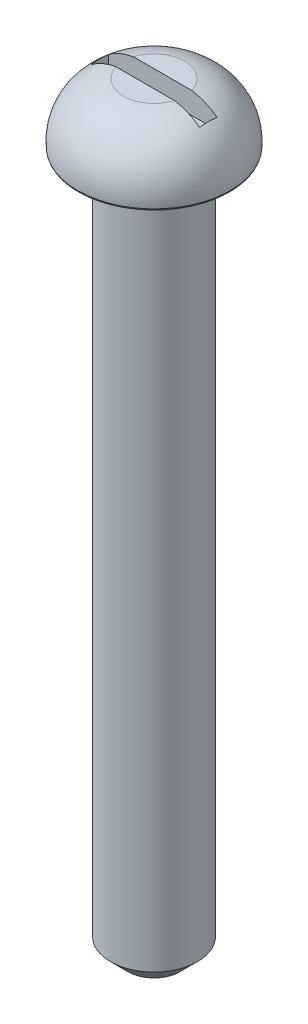
ISO-10303-21;
HEADER;
FILE_DESCRIPTION(('STEP AP214'),'2;1');
FILE_NAME('part.step','',(''),(''),'','','');
FILE_SCHEMA(('AUTOMOTIVE_DESIGN { 1 0 10303 214 1 1 1 1 }'));
ENDSEC;
DATA;
#1=APPLICATION_CONTEXT('core data for automotive mechanical design processes');
#2=APPLICATION_PROTOCOL_DEFINITION('international standard','automotive_design',2000,#1);
#3=PRODUCT_CONTEXT('',#1,'mechanical');
#4=PRODUCT('Part','Part','',(#3));
#5=PRODUCT_RELATED_PRODUCT_CATEGORY('part','',(#4));
#6=PRODUCT_DEFINITION_FORMATION('','',#4);
#7=PRODUCT_DEFINITION_CONTEXT('part definition',#1,'design');
#8=PRODUCT_DEFINITION('design','',#6,#7);
#9=PRODUCT_DEFINITION_SHAPE('','',#8);
#10=(LENGTH_UNIT() NAMED_UNIT(*) SI_UNIT(.MILLI.,.METRE.));
#11=(NAMED_UNIT(*) PLANE_ANGLE_UNIT() SI_UNIT($,.RADIAN.));
#12=(NAMED_UNIT(*) SI_UNIT($,.STERADIAN.) SOLID_ANGLE_UNIT());
#13=UNCERTAINTY_MEASURE_WITH_UNIT(LENGTH_MEASURE(1.E-05),#10,'distance_accuracy_value','');
#14=(GEOMETRIC_REPRESENTATION_CONTEXT(3) GLOBAL_UNCERTAINTY_ASSIGNED_CONTEXT((#13)) GLOBAL_UNIT_ASSIGNED_CONTEXT((#10,
#11,#12)) REPRESENTATION_CONTEXT('',''));
#15=CARTESIAN_POINT('',(0.,0.,0.));
#16=DIRECTION('',(0.,0.,1.));
#17=DIRECTION('',(1.,0.,0.));
#18=AXIS2_PLACEMENT_3D('',#15,#16,#17);
#19=CARTESIAN_POINT('',(0.,35.,0.));
#20=DIRECTION('',(0.,1.,0.));
#21=DIRECTION('',(0.,0.,1.));
#22=AXIS2_PLACEMENT_3D('',#19,#20,#21);
#23=PLANE('',#22);
#24=DIRECTION('',(-1.,0.,0.));
#25=VECTOR('',#24,1.);
#26=CARTESIAN_POINT('',(-2.5,35.,-0.4));
#27=LINE('',#26,#25);
#28=CARTESIAN_POINT('',(1.34164078649989,35.,-0.4));
#29=VERTEX_POINT('',#28);
#30=CARTESIAN_POINT('',(-1.34164078649989,35.,-0.4));
#31=VERTEX_POINT('',#30);
#32=EDGE_CURVE('E105',#29,#31,#27,.T.);
#33=ORIENTED_EDGE('',*,*,#32,.F.);
#34=CARTESIAN_POINT('',(0.,35.,0.));
#35=DIRECTION('',(0.,-1.,0.));
#36=DIRECTION('',(0.,0.,-1.));
#37=AXIS2_PLACEMENT_3D('',#34,#35,#36);
#38=CIRCLE('',#37,1.4);
#39=EDGE_CURVE('E128',#31,#29,#38,.T.);
#40=ORIENTED_EDGE('',*,*,#39,.F.);
#41=EDGE_LOOP('',(#33,#40));
#42=FACE_BOUND('',#41,.T.);
#43=ADVANCED_FACE('F29',(#42),#23,.T.);
#44=CARTESIAN_POINT('',(1.2,0.,0.));
#45=DIRECTION('',(0.,-1.,0.));
#46=DIRECTION('',(0.,0.,-1.));
#47=AXIS2_PLACEMENT_3D('',#44,#45,#46);
#48=PLANE('',#47);
#49=CARTESIAN_POINT('',(0.,0.,0.));
#50=DIRECTION('',(0.,-1.,0.));
#51=DIRECTION('',(0.,0.,-1.));
#52=AXIS2_PLACEMENT_3D('',#49,#50,#51);
#53=CIRCLE('',#52,1.2);
#54=CARTESIAN_POINT('',(0.,0.,-1.2));
#55=VERTEX_POINT('',#54);
#56=EDGE_CURVE('E115',#55,#55,#53,.T.);
#57=ORIENTED_EDGE('',*,*,#56,.T.);
#58=EDGE_LOOP('',(#57));
#59=FACE_BOUND('',#58,.T.);
#60=ADVANCED_FACE('F31',(#59),#48,.T.);
#61=DIRECTION('',(1.,0.,0.));
#62=VECTOR('',#61,1.);
#63=CARTESIAN_POINT('',(-2.5,35.,0.4));
#64=LINE('',#63,#62);
#65=CARTESIAN_POINT('',(-1.34164078649989,35.,0.4));
#66=VERTEX_POINT('',#65);
#67=CARTESIAN_POINT('',(1.34164078649989,35.,0.4));
#68=VERTEX_POINT('',#67);
#69=EDGE_CURVE('E107',#66,#68,#64,.T.);
#70=ORIENTED_EDGE('',*,*,#69,.F.);
#71=EDGE_CURVE('E131',#68,#66,#38,.T.);
#72=ORIENTED_EDGE('',*,*,#71,.F.);
#73=EDGE_LOOP('',(#70,#72));
#74=FACE_BOUND('',#73,.T.);
#75=ADVANCED_FACE('F176',(#74),#23,.T.);
#76=CARTESIAN_POINT('',(0.,32.5125,0.));
#77=DIRECTION('',(0.,-1.,0.));
#78=DIRECTION('',(0.,0.,-1.));
#79=AXIS2_PLACEMENT_3D('',#76,#77,#78);
#80=DEGENERATE_TOROIDAL_SURFACE('',#79,1.,2.5194555463433,.T.);
#81=CARTESIAN_POINT('',(0.,34.9594687881132,-0.4));
#82=CARTESIAN_POINT('',(-0.0338382677614268,34.9594721754177,-0.4));
#83=CARTESIAN_POINT('',(-0.067677964119435,34.9605534690235,-0.4));
#84=CARTESIAN_POINT('',(-0.135250580531707,34.9645271586809,-0.4));
#85=CARTESIAN_POINT('',(-0.168983458976539,34.9674201897673,-0.4));
#86=CARTESIAN_POINT('',(-0.236586103651417,34.9742723387306,-0.4));
#87=CARTESIAN_POINT('',(-0.270455020948054,34.9782392285523,-0.4));
#88=CARTESIAN_POINT('',(-0.338156940635543,34.9864955449094,-0.4));
#89=CARTESIAN_POINT('',(-0.371989936105779,34.9907850250498,-0.4));
#90=CARTESIAN_POINT('',(-0.455604149313946,35.0010989072908,-0.4));
#91=CARTESIAN_POINT('',(-0.505403039900188,35.0069905560453,-0.4));
#92=CARTESIAN_POINT('',(-0.605160163724098,35.0172184164192,-0.4));
#93=CARTESIAN_POINT('',(-0.655118370099626,35.021554877577,-0.4));
#94=CARTESIAN_POINT('',(-0.755158183029392,35.0281116283189,-0.4));
#95=CARTESIAN_POINT('',(-0.805239724114253,35.0303328670776,-0.4));
#96=CARTESIAN_POINT('',(-0.905451481224646,35.0323446383411,-0.4));
#97=CARTESIAN_POINT('',(-0.955581698913417,35.0321350846395,-0.4));
#98=CARTESIAN_POINT('',(-1.10519744004029,35.0275826093243,-0.4));
#99=CARTESIAN_POINT('',(-1.20460157264623,35.0193672135559,-0.4));
#100=CARTESIAN_POINT('',(-1.40192321413768,34.9918916724499,-0.4));
#101=CARTESIAN_POINT('',(-1.49984015178237,34.9726273880546,-0.4));
#102=CARTESIAN_POINT('',(-1.66562418126213,34.9299930807012,-0.4));
#103=CARTESIAN_POINT('',(-1.73418957692369,34.9093063038867,-0.4));
#104=CARTESIAN_POINT('',(-1.8693166192456,34.8623062089933,-0.4));
#105=CARTESIAN_POINT('',(-1.9358791538299,34.8359954273999,-0.4));
#106=CARTESIAN_POINT('',(-2.13232230422447,34.7485950153914,-0.4));
#107=CARTESIAN_POINT('',(-2.25860062073282,34.6791290253755,-0.4));
#108=CARTESIAN_POINT('',(-2.49744991030645,34.5198455931525,-0.4));
#109=CARTESIAN_POINT('',(-2.61002524010937,34.4300346455554,-0.4));
#110=CARTESIAN_POINT('',(-2.81813579673432,34.2326675848493,-0.4));
#111=CARTESIAN_POINT('',(-2.9136919776501,34.125133611118,-0.4));
#112=CARTESIAN_POINT('',(-3.084020861249,33.8967637441041,-0.4));
#113=CARTESIAN_POINT('',(-3.15903353936496,33.7761066918437,-0.4));
#114=CARTESIAN_POINT('',(-3.28766382741802,33.5238219313858,-0.4));
#115=CARTESIAN_POINT('',(-3.34127386321256,33.3921903593208,-0.4));
#116=CARTESIAN_POINT('',(-3.42530915106019,33.1223801199839,-0.4));
#117=CARTESIAN_POINT('',(-3.45583823753319,32.984233780706,-0.4));
#118=CARTESIAN_POINT('',(-3.49323058953172,32.7047946739299,-0.4));
#119=CARTESIAN_POINT('',(-3.50009745955316,32.5635023889581,-0.4));
#120=CARTESIAN_POINT('',(-3.48998437740454,32.2819727914454,-0.4));
#121=CARTESIAN_POINT('',(-3.47303776304047,32.1417342798249,-0.4));
#122=CARTESIAN_POINT('',(-3.41583978349253,31.8660706381648,-0.4));
#123=CARTESIAN_POINT('',(-3.37558477651418,31.7306462638152,-0.4));
#124=CARTESIAN_POINT('',(-3.27291000213663,31.4684418568154,-0.4));
#125=CARTESIAN_POINT('',(-3.21048499893456,31.3416638745886,-0.4));
#126=CARTESIAN_POINT('',(-3.06529958238939,31.1004253875458,-0.4));
#127=CARTESIAN_POINT('',(-2.98254846845237,30.9859592842568,-0.4));
#128=CARTESIAN_POINT('',(-2.79895170451083,30.772356227364,-0.4));
#129=CARTESIAN_POINT('',(-2.69808464515237,30.6732376723482,-0.4));
#130=CARTESIAN_POINT('',(-2.48109536029555,30.4931192895068,-0.4));
#131=CARTESIAN_POINT('',(-2.36495283010315,30.4121439725998,-0.4));
#132=CARTESIAN_POINT('',(-2.12003686955878,30.2702055463965,-0.4));
#133=CARTESIAN_POINT('',(-1.99119324147536,30.2093628035941,-0.4));
#134=CARTESIAN_POINT('',(-1.792084554005,30.1348165249818,-0.4));
#135=CARTESIAN_POINT('',(-1.72482351761207,30.112770190514,-0.4));
#136=CARTESIAN_POINT('',(-1.58871399977605,30.074248069245,-0.4));
#137=CARTESIAN_POINT('',(-1.51986566275126,30.0577717777811,-0.4));
#138=CARTESIAN_POINT('',(-1.37991833917445,30.0301913167248,-0.4));
#139=CARTESIAN_POINT('',(-1.30880096493827,30.0191810623686,-0.4));
#140=CARTESIAN_POINT('',(-1.16590883388618,30.0028540264087,-0.4));
#141=CARTESIAN_POINT('',(-1.09413397404903,29.9975381529959,-0.4));
#142=CARTESIAN_POINT('',(-0.950184709290663,29.9923360188387,-0.4));
#143=CARTESIAN_POINT('',(-0.878009750752931,29.9924659131582,-0.4));
#144=CARTESIAN_POINT('',(-0.733868359233075,29.9976141000356,-0.4));
#145=CARTESIAN_POINT('',(-0.661901885229659,30.0026313546615,-0.4));
#146=CARTESIAN_POINT('',(-0.527362844770211,30.0154201147344,-0.4));
#147=CARTESIAN_POINT('',(-0.464745964796624,30.0227664151524,-0.4));
#148=CARTESIAN_POINT('',(-0.370921074758577,30.0343512736872,-0.4));
#149=CARTESIAN_POINT('',(-0.339674021780249,30.0383056106516,-0.4));
#150=CARTESIAN_POINT('',(-0.27714074503957,30.0459577789511,-0.4));
#151=CARTESIAN_POINT('',(-0.24585451499118,30.0496555616753,-0.4));
#152=CARTESIAN_POINT('',(-0.183022337538641,30.0562464425247,-0.4));
#153=CARTESIAN_POINT('',(-0.151475896905257,30.0591351211382,-0.4));
#154=CARTESIAN_POINT('',(-0.0882845194117533,30.0634407062094,-0.4));
#155=CARTESIAN_POINT('',(-0.0566396201019121,30.0648581178138,-0.4));
#156=CARTESIAN_POINT('',(0.00670900055784086,30.0658228744264,-0.4));
#157=CARTESIAN_POINT('',(0.0384127491098397,30.0653686014411,-0.4));
#158=CARTESIAN_POINT('',(0.101755848962485,30.0627217036994,-0.4));
#159=CARTESIAN_POINT('',(0.133395161231615,30.0605282297223,-0.4));
#160=CARTESIAN_POINT('',(0.197075668927702,30.0549206280494,-0.4));
#161=CARTESIAN_POINT('',(0.229115032813026,30.0514872303989,-0.4));
#162=CARTESIAN_POINT('',(0.293132454280722,30.0440721569489,-0.4));
#163=CARTESIAN_POINT('',(0.325110499752561,30.0400903822904,-0.4));
#164=CARTESIAN_POINT('',(0.389068757237893,30.032113224633,-0.4));
#165=CARTESIAN_POINT('',(0.421048969105001,30.0281178401912,-0.4));
#166=CARTESIAN_POINT('',(0.485051815385014,30.0204868263652,-0.4));
#167=CARTESIAN_POINT('',(0.517074449026828,30.0168511905303,-0.4));
#168=CARTESIAN_POINT('',(0.613199905067885,30.0068908859735,-0.4));
#169=CARTESIAN_POINT('',(0.67740855069488,30.0015058987141,-0.4));
#170=CARTESIAN_POINT('',(0.806040956986536,29.9944125710688,-0.4));
#171=CARTESIAN_POINT('',(0.870464712950289,29.9927041508571,-0.4));
#172=CARTESIAN_POINT('',(0.998362213092594,29.9934918122463,-0.4));
#173=CARTESIAN_POINT('',(1.06183615678955,29.9959271498237,-0.4));
#174=CARTESIAN_POINT('',(1.18845961005121,30.0051429318533,-0.4));
#175=CARTESIAN_POINT('',(1.25160909489982,30.0119237025194,-0.4));
#176=CARTESIAN_POINT('',(1.44046174579123,30.0390588425836,-0.4));
#177=CARTESIAN_POINT('',(1.56529661737749,30.0662059685067,-0.4));
#178=CARTESIAN_POINT('',(1.75532938071436,30.1225098666057,-0.4));
#179=CARTESIAN_POINT('',(1.82244963264302,30.1454497391749,-0.400000000000001));
#180=CARTESIAN_POINT('',(1.95446682454811,30.1967759205072,-0.400000000000001));
#181=CARTESIAN_POINT('',(2.01936724896691,30.2251531837482,-0.400000000000001));
#182=CARTESIAN_POINT('',(2.14746610091274,30.287655872903,-0.400000000000001));
#183=CARTESIAN_POINT('',(2.21062807916091,30.3218560714777,-0.400000000000001));
#184=CARTESIAN_POINT('',(2.33384141088278,30.3954981556499,-0.400000000000001));
#185=CARTESIAN_POINT('',(2.39389112687907,30.4349427623866,-0.400000000000001));
#186=CARTESIAN_POINT('',(2.56822105293429,30.5604414895362,-0.400000000000001));
#187=CARTESIAN_POINT('',(2.67727417342556,30.6539498739746,-0.400000000000001));
#188=CARTESIAN_POINT('',(2.87731664505904,30.8575381230657,-0.400000000000001));
#189=CARTESIAN_POINT('',(2.96839942775862,30.967526745611,-0.400000000000001));
#190=CARTESIAN_POINT('',(3.13011034367072,31.2005805767337,-0.400000000000001));
#191=CARTESIAN_POINT('',(3.2008690104347,31.3235550656091,-0.400000000000001));
#192=CARTESIAN_POINT('',(3.32076250094826,31.5798864015786,-0.400000000000001));
#193=CARTESIAN_POINT('',(3.36985981264247,31.7132607924853,-0.400000000000001));
#194=CARTESIAN_POINT('',(3.44466082174416,31.9857648809142,-0.400000000000001));
#195=CARTESIAN_POINT('',(3.47046942013737,32.124865789526,-0.400000000000001));
#196=CARTESIAN_POINT('',(3.49832209574621,32.4053506959011,-0.400000000000001));
#197=CARTESIAN_POINT('',(3.50037915256109,32.5467334044125,-0.400000000000001));
#198=CARTESIAN_POINT('',(3.48071400899756,32.827680796085,-0.400000000000001));
#199=CARTESIAN_POINT('',(3.45901751439648,32.9672472794955,-0.400000000000001));
#200=CARTESIAN_POINT('',(3.39249967383479,33.2407968712602,-0.400000000000001));
#201=CARTESIAN_POINT('',(3.34767190795041,33.3747784183909,-0.400000000000001));
#202=CARTESIAN_POINT('',(3.23615362082009,33.6333685749116,-0.400000000000001));
#203=CARTESIAN_POINT('',(3.16945508114511,33.7579737260251,-0.400000000000001));
#204=CARTESIAN_POINT('',(3.01616115015903,33.994170437646,-0.400000000000001));
#205=CARTESIAN_POINT('',(2.92957716226702,34.1057694015433,-0.400000000000001));
#206=CARTESIAN_POINT('',(2.7388440090825,34.3130500055762,-0.400000000000001));
#207=CARTESIAN_POINT('',(2.63467263893206,34.4087112164015,-0.400000000000001));
#208=CARTESIAN_POINT('',(2.41166340004832,34.5814542600167,-0.400000000000001));
#209=CARTESIAN_POINT('',(2.29280072738463,34.6585040042624,-0.400000000000001));
#210=CARTESIAN_POINT('',(2.0430030813058,34.7922605207593,-0.400000000000001));
#211=CARTESIAN_POINT('',(1.9119902448074,34.8488227998933,-0.4));
#212=CARTESIAN_POINT('',(1.7102956255584,34.9167355419974,-0.4));
#213=CARTESIAN_POINT('',(1.6423386050226,34.9365291975629,-0.4));
#214=CARTESIAN_POINT('',(1.50500335369697,34.970535819594,-0.4));
#215=CARTESIAN_POINT('',(1.4356246269105,34.9847468022932,-0.4));
#216=CARTESIAN_POINT('',(1.27838918164238,35.0104556218676,-0.4));
#217=CARTESIAN_POINT('',(1.19027247123465,35.0203729092839,-0.4));
#218=CARTESIAN_POINT('',(1.01355864413964,35.031745217942,-0.4));
#219=CARTESIAN_POINT('',(0.924961815219303,35.0332048448398,-0.4));
#220=CARTESIAN_POINT('',(0.791965647083475,35.0297457589619,-0.4));
#221=CARTESIAN_POINT('',(0.747467524576735,35.0276346462116,-0.4));
#222=CARTESIAN_POINT('',(0.658580235401699,35.021753448913,-0.4));
#223=CARTESIAN_POINT('',(0.614191070131035,35.0179833431949,-0.4));
#224=CARTESIAN_POINT('',(0.525521437051802,35.0091681976184,-0.4));
#225=CARTESIAN_POINT('',(0.481241040864881,35.004122470548,-0.4));
#226=CARTESIAN_POINT('',(0.392755822811401,34.9934177415786,-0.4));
#227=CARTESIAN_POINT('',(0.348551004111971,34.9877587145892,-0.4));
#228=CARTESIAN_POINT('',(0.278970443467459,34.9792802111881,-0.4));
#229=CARTESIAN_POINT('',(0.253617379606726,34.976280354131,-0.4));
#230=CARTESIAN_POINT('',(0.202862030439113,34.9707658833481,-0.4));
#231=CARTESIAN_POINT('',(0.177459757037149,34.9682511642246,-0.4));
#232=CARTESIAN_POINT('',(0.126738568217441,34.9640518042722,-0.4));
#233=CARTESIAN_POINT('',(0.101420084319055,34.9623622119908,-0.4));
#234=CARTESIAN_POINT('',(0.0507346632318562,34.9600695076987,-0.4));
#235=CARTESIAN_POINT('',(0.0253677330615109,34.9594662487327,-0.4));
#236=CARTESIAN_POINT('',(0.,34.9594687881132,-0.4));
#237=B_SPLINE_CURVE_WITH_KNOTS('',3,(#81,#82,#83,#84,#85,#86,#87,#88,#89,#90,#91,#92,#93,#94,
#95,#96,#97,#98,#99,#100,#101,#102,#103,#104,#105,#106,#107,#108,#109,#110,#111,#112,#113,#114,
#115,#116,#117,#118,#119,#120,#121,#122,#123,#124,#125,#126,#127,#128,#129,#130,#131,#132,#133,
#134,#135,#136,#137,#138,#139,#140,#141,#142,#143,#144,#145,#146,#147,#148,#149,#150,#151,#152,
#153,#154,#155,#156,#157,#158,#159,#160,#161,#162,#163,#164,#165,#166,#167,#168,#169,#170,#171,
#172,#173,#174,#175,#176,#177,#178,#179,#180,#181,#182,#183,#184,#185,#186,#187,#188,#189,#190,
#191,#192,#193,#194,#195,#196,#197,#198,#199,#200,#201,#202,#203,#204,#205,#206,#207,#208,#209,
#210,#211,#212,#213,#214,#215,#216,#217,#218,#219,#220,#221,#222,#223,#224,#225,#226,#227,#228,
#229,#230,#231,#232,#233,#234,#235,#236),.UNSPECIFIED.,.T.,.F.,(4,2,2,2,2,2,2,2,2,2,2,2,2,2,2,2,
2,2,2,2,2,2,2,2,2,2,2,2,2,2,2,2,2,2,2,2,2,2,2,2,2,2,2,2,2,2,2,2,2,2,2,2,2,2,2,2,2,2,2,2,2,2,2,2,
2,2,2,2,2,2,2,2,2,2,2,2,2,4),(0.,0.101504820932103,0.203045240398577,0.305341160156972,
0.407654116223659,0.558081783931964,0.708485303870073,0.858821300608501,1.00916262892524,
1.30776882315044,1.60648695227951,1.82109723915609,2.03561093798815,2.46573265684931,
2.89571726330222,3.32516875395588,3.7493660480948,4.17371332786318,4.5961400441297,
5.01850240874496,5.44027407379523,5.8621116558905,6.28404892806824,6.70579351796423,
7.12803984347599,7.55085321578287,7.9761506138383,8.18830163157114,8.40043342262916,
8.6160936898064,8.83178834730523,9.04812291583579,9.26441155126527,9.45352775460854,
9.54801820378475,9.64252650798969,9.73754139533282,9.83252364934071,9.92758802877956,
10.022698855065,10.1193563532496,10.2160312993006,10.3127168351883,10.4094006371196,
10.6026220243656,10.7958392163339,10.9862483442131,11.1766717678777,11.5583291965066,
11.7709265896662,11.9831733338554,12.1983855488727,12.4137098689357,12.8424067104954,
13.2688122625346,13.692414601143,14.1167476610478,14.5391596860364,14.9613408629157,
15.3830656121491,15.8049074711653,16.2269041622917,16.6486594586918,17.0709512775254,
17.4939660660107,17.9199087118788,18.132056911754,18.3442804290728,18.609863453294,
18.8753018395141,19.008919354105,19.1425385737906,19.2762299317647,19.4099267612036,
19.4865147484735,19.5630860779915,19.6391920897656,19.7152878054215),.UNSPECIFIED.);
#238=CARTESIAN_POINT('',(2.5,34.5128129281362,-0.400000000000001));
#239=VERTEX_POINT('',#238);
#240=EDGE_CURVE('E11',#239,#29,#237,.T.);
#241=ORIENTED_EDGE('',*,*,#240,.F.);
#242=CARTESIAN_POINT('',(2.5,34.5367668425877,0.));
#243=CARTESIAN_POINT('',(2.5,34.5367670015249,-0.091500264816902));
#244=CARTESIAN_POINT('',(2.5,34.5330519280067,-0.183007797475908));
#245=CARTESIAN_POINT('',(2.5,34.5180908020495,-0.365383970362098));
#246=CARTESIAN_POINT('',(2.5,34.5068432122217,-0.456252476337135));
#247=CARTESIAN_POINT('',(2.5,34.461362155303,-0.726544822515579));
#248=CARTESIAN_POINT('',(2.5,34.4153942264796,-0.904280473858293));
#249=CARTESIAN_POINT('',(2.5,34.3069506191006,-1.19748232639554));
#250=CARTESIAN_POINT('',(2.5,34.2530376109683,-1.31614405769195));
#251=CARTESIAN_POINT('',(2.5,34.1266561677641,-1.54325305912053));
#252=CARTESIAN_POINT('',(2.5,34.0541987569766,-1.65170634576009));
#253=CARTESIAN_POINT('',(2.5,33.8902299193953,-1.8548043569158));
#254=CARTESIAN_POINT('',(2.5,33.7985618626584,-1.94932395558131));
#255=CARTESIAN_POINT('',(2.5,33.5983729261488,-2.11853619772126));
#256=CARTESIAN_POINT('',(2.5,33.4898632613297,-2.19324194635525));
#257=CARTESIAN_POINT('',(2.5,33.275575093763,-2.3097698044652));
#258=CARTESIAN_POINT('',(2.5,33.1714856021864,-2.35470691354324));
#259=CARTESIAN_POINT('',(2.5,32.9567699842453,-2.42442000934845));
#260=CARTESIAN_POINT('',(2.5,32.8461483261894,-2.44920961041039));
#261=CARTESIAN_POINT('',(2.5,32.6327053910413,-2.47608357714888));
#262=CARTESIAN_POINT('',(2.5,32.5301195153304,-2.48007087085806));
#263=CARTESIAN_POINT('',(2.5,32.3258092703255,-2.47031652720577));
#264=CARTESIAN_POINT('',(2.5,32.2240846925092,-2.45657931214316));
#265=CARTESIAN_POINT('',(2.5,32.0268160142359,-2.41248488240354));
#266=CARTESIAN_POINT('',(2.5,31.931183203771,-2.38252153712198));
#267=CARTESIAN_POINT('',(2.5,31.7460931871743,-2.30742528464294));
#268=CARTESIAN_POINT('',(2.5,31.6566363629631,-2.26229144031842));
#269=CARTESIAN_POINT('',(2.5,31.4833361297419,-2.15692413643585));
#270=CARTESIAN_POINT('',(2.5,31.3997500402724,-2.09626890754031));
#271=CARTESIAN_POINT('',(2.5,31.2429648945198,-1.96281078422355));
#272=CARTESIAN_POINT('',(2.5,31.1697680067489,-1.89000536060222));
#273=CARTESIAN_POINT('',(2.5,31.0289264329146,-1.72790867535516));
#274=CARTESIAN_POINT('',(2.5,30.9622958758047,-1.63773913873686));
#275=CARTESIAN_POINT('',(2.5,30.8427839181365,-1.44874918190837));
#276=CARTESIAN_POINT('',(2.5,30.7899107052323,-1.34992365665206));
#277=CARTESIAN_POINT('',(2.5,30.6776441076254,-1.10212490845804));
#278=CARTESIAN_POINT('',(2.5,30.6253136882517,-0.949942139465323));
#279=CARTESIAN_POINT('',(2.5,30.5459322266467,-0.639039136176452));
#280=CARTESIAN_POINT('',(2.5,30.5189387998828,-0.480304854809005));
#281=CARTESIAN_POINT('',(2.5,30.4879004512649,-0.157865091630422));
#282=CARTESIAN_POINT('',(2.5,30.4842658381049,0.00587876292040268));
#283=CARTESIAN_POINT('',(2.5,30.5006814189312,0.332122170327462));
#284=CARTESIAN_POINT('',(2.5,30.520714470928,0.494622538061394));
#285=CARTESIAN_POINT('',(2.5,30.5827239177504,0.797277045413256));
#286=CARTESIAN_POINT('',(2.5,30.6221064017617,0.937953830788711));
#287=CARTESIAN_POINT('',(2.5,30.7230465774401,1.21111704379188));
#288=CARTESIAN_POINT('',(2.5,30.7845703220913,1.34361564786348));
#289=CARTESIAN_POINT('',(2.5,30.9177233191766,1.57250786917698));
#290=CARTESIAN_POINT('',(2.5,30.985543898468,1.67110875342554));
#291=CARTESIAN_POINT('',(2.5,31.1366125292409,1.85580706618106));
#292=CARTESIAN_POINT('',(2.5,31.2198577567511,1.94190677828607));
#293=CARTESIAN_POINT('',(2.5,31.4009748654164,2.0984087573094));
#294=CARTESIAN_POINT('',(2.5,31.4989323028123,2.16871276558768));
#295=CARTESIAN_POINT('',(2.5,31.7064469321812,2.28944621439157));
#296=CARTESIAN_POINT('',(2.5,31.8159983238678,2.33988553385618));
#297=CARTESIAN_POINT('',(2.5,32.0304039926849,2.41388256230386));
#298=CARTESIAN_POINT('',(2.5,32.1344531251417,2.43978388133006));
#299=CARTESIAN_POINT('',(2.5,32.3454957286839,2.47254011541879));
#300=CARTESIAN_POINT('',(2.5,32.4524878924767,2.47940335349103));
#301=CARTESIAN_POINT('',(2.5,32.6596624673535,2.47395032082968));
#302=CARTESIAN_POINT('',(2.5,32.7598758808131,2.4627364567631));
#303=CARTESIAN_POINT('',(2.5,32.9569791779968,2.42364412292457));
#304=CARTESIAN_POINT('',(2.5,33.053869426513,2.39576748849706));
#305=CARTESIAN_POINT('',(2.5,33.2418158126943,2.32442672746202));
#306=CARTESIAN_POINT('',(2.5,33.3328658945149,2.28094671968089));
#307=CARTESIAN_POINT('',(2.5,33.5068611882592,2.180054884299));
#308=CARTESIAN_POINT('',(2.5,33.5898051134109,2.12264084983198));
#309=CARTESIAN_POINT('',(2.5,33.7501522532948,1.99249036295087));
#310=CARTESIAN_POINT('',(2.5,33.8270218533704,1.91909863435174));
#311=CARTESIAN_POINT('',(2.5,33.9688300237409,1.76162591724045));
#312=CARTESIAN_POINT('',(2.5,34.033765096437,1.67754180733592));
#313=CARTESIAN_POINT('',(2.5,34.1579498910983,1.49117286112959));
#314=CARTESIAN_POINT('',(2.5,34.2157195955858,1.38790535829523));
#315=CARTESIAN_POINT('',(2.5,34.3162174418205,1.17435438100939));
#316=CARTESIAN_POINT('',(2.5,34.3589365686593,1.06406674821157));
#317=CARTESIAN_POINT('',(2.5,34.4430915918002,0.798248126082735));
#318=CARTESIAN_POINT('',(2.5,34.4784756070002,0.640780050388817));
#319=CARTESIAN_POINT('',(2.5,34.5135874587563,0.402013236836224));
#320=CARTESIAN_POINT('',(2.5,34.52229683123,0.321862262979058));
#321=CARTESIAN_POINT('',(2.5,34.5338856326612,0.161142655354646));
#322=CARTESIAN_POINT('',(2.5,34.5367667026293,0.0805741455554337));
#323=CARTESIAN_POINT('',(2.5,34.5367668425877,0.));
#324=B_SPLINE_CURVE_WITH_KNOTS('',3,(#242,#243,#244,#245,#246,#247,#248,#249,#250,#251,#252,
#253,#254,#255,#256,#257,#258,#259,#260,#261,#262,#263,#264,#265,#266,#267,#268,#269,#270,#271,
#272,#273,#274,#275,#276,#277,#278,#279,#280,#281,#282,#283,#284,#285,#286,#287,#288,#289,#290,
#291,#292,#293,#294,#295,#296,#297,#298,#299,#300,#301,#302,#303,#304,#305,#306,#307,#308,#309,
#310,#311,#312,#313,#314,#315,#316,#317,#318,#319,#320,#321,#322,#323),.UNSPECIFIED.,.T.,.F.,(4,
2,2,2,2,2,2,2,2,2,2,2,2,2,2,2,2,2,2,2,2,2,2,2,2,2,2,2,2,2,2,2,2,2,2,2,2,2,2,2,4),(0.,
0.27441501458653,0.548886054437859,1.09597501657236,1.48555741429441,1.87490874869223,
2.26756751275134,2.65996591542711,2.99822121841734,3.33624776067342,3.64273043744199,
3.94913666098119,4.24841843240524,4.54771869475692,4.8562256713324,5.16479694740183,
5.49982491015698,5.83505181036272,6.31520170952833,6.79644082691913,7.28611055366777,
7.77542584029954,8.21207460177579,8.64805672506248,9.00561192257922,9.36310172283597,
9.72275727557959,10.0822337409247,10.4022372415518,10.722100821967,11.0231846135131,
11.324235247868,11.6255931658266,11.9269988439299,12.2445251339687,12.5621443321505,
12.9157856276996,13.269638386591,13.7514678815871,13.9931828479188,14.2348297477626),.UNSPECIFIED.);
#325=CARTESIAN_POINT('',(2.5,34.5128129281342,0.4));
#326=VERTEX_POINT('',#325);
#327=EDGE_CURVE('E33',#326,#239,#324,.T.);
#328=ORIENTED_EDGE('',*,*,#327,.F.);
#329=CARTESIAN_POINT('',(0.,34.9594687881132,0.4));
#330=CARTESIAN_POINT('',(0.0338382677614264,34.9594721754177,0.4));
#331=CARTESIAN_POINT('',(0.0676779641194346,34.9605534690235,0.4));
#332=CARTESIAN_POINT('',(0.135250580531706,34.9645271586809,0.4));
#333=CARTESIAN_POINT('',(0.168983458976539,34.9674201897673,0.4));
#334=CARTESIAN_POINT('',(0.236586103651417,34.9742723387306,0.4));
#335=CARTESIAN_POINT('',(0.270455020948053,34.9782392285523,0.4));
#336=CARTESIAN_POINT('',(0.338156940635542,34.9864955449094,0.4));
#337=CARTESIAN_POINT('',(0.371989936105778,34.9907850250498,0.4));
#338=CARTESIAN_POINT('',(0.455604149313945,35.0010989072908,0.4));
#339=CARTESIAN_POINT('',(0.505403039900187,35.0069905560453,0.4));
#340=CARTESIAN_POINT('',(0.605160163724097,35.0172184164192,0.4));
#341=CARTESIAN_POINT('',(0.655118370099626,35.021554877577,0.4));
#342=CARTESIAN_POINT('',(0.755158183029392,35.0281116283189,0.4));
#343=CARTESIAN_POINT('',(0.805239724114253,35.0303328670776,0.4));
#344=CARTESIAN_POINT('',(0.905451481224646,35.0323446383411,0.4));
#345=CARTESIAN_POINT('',(0.955581698913416,35.0321350846395,0.4));
#346=CARTESIAN_POINT('',(1.10519744004029,35.0275826093243,0.4));
#347=CARTESIAN_POINT('',(1.20460157264623,35.0193672135559,0.4));
#348=CARTESIAN_POINT('',(1.40192321413768,34.9918916724499,0.4));
#349=CARTESIAN_POINT('',(1.49984015178237,34.9726273880546,0.4));
#350=CARTESIAN_POINT('',(1.66562418126213,34.9299930807012,0.4));
#351=CARTESIAN_POINT('',(1.73418957692369,34.9093063038867,0.4));
#352=CARTESIAN_POINT('',(1.8693166192456,34.8623062089933,0.4));
#353=CARTESIAN_POINT('',(1.9358791538299,34.8359954273999,0.4));
#354=CARTESIAN_POINT('',(2.13232230422447,34.7485950153914,0.4));
#355=CARTESIAN_POINT('',(2.25860062073282,34.6791290253755,0.4));
#356=CARTESIAN_POINT('',(2.49744991030645,34.5198455931525,0.4));
#357=CARTESIAN_POINT('',(2.61002524010937,34.4300346455554,0.4));
#358=CARTESIAN_POINT('',(2.81813579673432,34.2326675848493,0.4));
#359=CARTESIAN_POINT('',(2.9136919776501,34.125133611118,0.4));
#360=CARTESIAN_POINT('',(3.084020861249,33.8967637441041,0.4));
#361=CARTESIAN_POINT('',(3.15903353936496,33.7761066918437,0.4));
#362=CARTESIAN_POINT('',(3.28766382741802,33.5238219313858,0.4));
#363=CARTESIAN_POINT('',(3.34127386321256,33.3921903593208,0.4));
#364=CARTESIAN_POINT('',(3.42530915106019,33.1223801199839,0.4));
#365=CARTESIAN_POINT('',(3.45583823753319,32.984233780706,0.399999999999999));
#366=CARTESIAN_POINT('',(3.49323058953172,32.7047946739299,0.399999999999999));
#367=CARTESIAN_POINT('',(3.50009745955316,32.5635023889581,0.399999999999999));
#368=CARTESIAN_POINT('',(3.48998437740454,32.2819727914454,0.399999999999999));
#369=CARTESIAN_POINT('',(3.47303776304047,32.1417342798249,0.4));
#370=CARTESIAN_POINT('',(3.41583978349253,31.8660706381648,0.4));
#371=CARTESIAN_POINT('',(3.37558477651418,31.7306462638152,0.4));
#372=CARTESIAN_POINT('',(3.27291000213663,31.4684418568154,0.4));
#373=CARTESIAN_POINT('',(3.21048499893456,31.3416638745886,0.4));
#374=CARTESIAN_POINT('',(3.06529958238939,31.1004253875458,0.4));
#375=CARTESIAN_POINT('',(2.98254846845237,30.9859592842568,0.4));
#376=CARTESIAN_POINT('',(2.79895170451083,30.772356227364,0.4));
#377=CARTESIAN_POINT('',(2.69808464515237,30.6732376723482,0.4));
#378=CARTESIAN_POINT('',(2.48109536029555,30.4931192895068,0.4));
#379=CARTESIAN_POINT('',(2.36495283010315,30.4121439725998,0.4));
#380=CARTESIAN_POINT('',(2.12003686955878,30.2702055463965,0.4));
#381=CARTESIAN_POINT('',(1.99119324147536,30.2093628035941,0.4));
#382=CARTESIAN_POINT('',(1.792084554005,30.1348165249818,0.4));
#383=CARTESIAN_POINT('',(1.72482351761207,30.112770190514,0.4));
#384=CARTESIAN_POINT('',(1.58871399977605,30.074248069245,0.4));
#385=CARTESIAN_POINT('',(1.51986566275126,30.0577717777811,0.4));
#386=CARTESIAN_POINT('',(1.37991833917445,30.0301913167248,0.4));
#387=CARTESIAN_POINT('',(1.30880096493827,30.0191810623686,0.4));
#388=CARTESIAN_POINT('',(1.16590883388618,30.0028540264087,0.4));
#389=CARTESIAN_POINT('',(1.09413397404904,29.9975381529959,0.4));
#390=CARTESIAN_POINT('',(0.950184709290663,29.9923360188387,0.4));
#391=CARTESIAN_POINT('',(0.878009750752931,29.9924659131582,0.4));
#392=CARTESIAN_POINT('',(0.733868359233076,29.9976141000356,0.4));
#393=CARTESIAN_POINT('',(0.66190188522966,30.0026313546615,0.4));
#394=CARTESIAN_POINT('',(0.527362844770212,30.0154201147344,0.4));
#395=CARTESIAN_POINT('',(0.464745964796626,30.0227664151524,0.4));
#396=CARTESIAN_POINT('',(0.37092107475858,30.0343512736872,0.4));
#397=CARTESIAN_POINT('',(0.339674021780251,30.0383056106516,0.4));
#398=CARTESIAN_POINT('',(0.277140745039573,30.0459577789511,0.4));
#399=CARTESIAN_POINT('',(0.245854514991182,30.0496555616753,0.4));
#400=CARTESIAN_POINT('',(0.183022337538643,30.0562464425247,0.4));
#401=CARTESIAN_POINT('',(0.151475896905259,30.0591351211382,0.4));
#402=CARTESIAN_POINT('',(0.0882845194117553,30.0634407062094,0.4));
#403=CARTESIAN_POINT('',(0.056639620101914,30.0648581178138,0.4));
#404=CARTESIAN_POINT('',(-0.00670900055783922,30.0658228744264,0.4));
#405=CARTESIAN_POINT('',(-0.0384127491098384,30.0653686014411,0.4));
#406=CARTESIAN_POINT('',(-0.101755848962484,30.0627217036994,0.4));
#407=CARTESIAN_POINT('',(-0.133395161231614,30.0605282297223,0.4));
#408=CARTESIAN_POINT('',(-0.1970756689277,30.0549206280494,0.4));
#409=CARTESIAN_POINT('',(-0.229115032813024,30.0514872303989,0.4));
#410=CARTESIAN_POINT('',(-0.29313245428072,30.0440721569489,0.4));
#411=CARTESIAN_POINT('',(-0.325110499752559,30.0400903822904,0.4));
#412=CARTESIAN_POINT('',(-0.389068757237891,30.032113224633,0.4));
#413=CARTESIAN_POINT('',(-0.421048969104999,30.0281178401912,0.4));
#414=CARTESIAN_POINT('',(-0.485051815385012,30.0204868263652,0.4));
#415=CARTESIAN_POINT('',(-0.517074449026825,30.0168511905303,0.4));
#416=CARTESIAN_POINT('',(-0.613199905067882,30.0068908859735,0.4));
#417=CARTESIAN_POINT('',(-0.677408550694876,30.0015058987141,0.4));
#418=CARTESIAN_POINT('',(-0.806040956986532,29.9944125710688,0.4));
#419=CARTESIAN_POINT('',(-0.870464712950285,29.9927041508571,0.4));
#420=CARTESIAN_POINT('',(-0.998362213092591,29.9934918122463,0.4));
#421=CARTESIAN_POINT('',(-1.06183615678955,29.9959271498237,0.4));
#422=CARTESIAN_POINT('',(-1.18845961005121,30.0051429318533,0.4));
#423=CARTESIAN_POINT('',(-1.25160909489982,30.0119237025194,0.4));
#424=CARTESIAN_POINT('',(-1.44046174579123,30.0390588425836,0.4));
#425=CARTESIAN_POINT('',(-1.56529661737748,30.0662059685067,0.4));
#426=CARTESIAN_POINT('',(-1.75532938071436,30.1225098666057,0.4));
#427=CARTESIAN_POINT('',(-1.82244963264302,30.1454497391749,0.4));
#428=CARTESIAN_POINT('',(-1.9544668245481,30.1967759205072,0.4));
#429=CARTESIAN_POINT('',(-2.0193672489669,30.2251531837482,0.4));
#430=CARTESIAN_POINT('',(-2.14746610091274,30.287655872903,0.4));
#431=CARTESIAN_POINT('',(-2.2106280791609,30.3218560714777,0.4));
#432=CARTESIAN_POINT('',(-2.33384141088278,30.3954981556499,0.4));
#433=CARTESIAN_POINT('',(-2.39389112687907,30.4349427623866,0.4));
#434=CARTESIAN_POINT('',(-2.56822105293428,30.5604414895362,0.4));
#435=CARTESIAN_POINT('',(-2.67727417342556,30.6539498739746,0.4));
#436=CARTESIAN_POINT('',(-2.87731664505904,30.8575381230657,0.4));
#437=CARTESIAN_POINT('',(-2.96839942775861,30.967526745611,0.4));
#438=CARTESIAN_POINT('',(-3.13011034367072,31.2005805767337,0.4));
#439=CARTESIAN_POINT('',(-3.2008690104347,31.3235550656091,0.4));
#440=CARTESIAN_POINT('',(-3.32076250094825,31.5798864015786,0.4));
#441=CARTESIAN_POINT('',(-3.36985981264247,31.7132607924853,0.4));
#442=CARTESIAN_POINT('',(-3.44466082174416,31.9857648809142,0.4));
#443=CARTESIAN_POINT('',(-3.47046942013737,32.1248657895259,0.400000000000001));
#444=CARTESIAN_POINT('',(-3.49832209574621,32.4053506959011,0.400000000000001));
#445=CARTESIAN_POINT('',(-3.50037915256109,32.5467334044125,0.400000000000001));
#446=CARTESIAN_POINT('',(-3.48071400899756,32.827680796085,0.400000000000001));
#447=CARTESIAN_POINT('',(-3.45901751439648,32.9672472794955,0.4));
#448=CARTESIAN_POINT('',(-3.39249967383479,33.2407968712602,0.4));
#449=CARTESIAN_POINT('',(-3.34767190795041,33.3747784183909,0.4));
#450=CARTESIAN_POINT('',(-3.23615362082009,33.6333685749116,0.4));
#451=CARTESIAN_POINT('',(-3.16945508114511,33.7579737260251,0.4));
#452=CARTESIAN_POINT('',(-3.01616115015904,33.9941704376459,0.4));
#453=CARTESIAN_POINT('',(-2.92957716226703,34.1057694015433,0.4));
#454=CARTESIAN_POINT('',(-2.73884400908251,34.3130500055762,0.4));
#455=CARTESIAN_POINT('',(-2.63467263893207,34.4087112164015,0.4));
#456=CARTESIAN_POINT('',(-2.41166340004833,34.5814542600167,0.4));
#457=CARTESIAN_POINT('',(-2.29280072738464,34.6585040042624,0.4));
#458=CARTESIAN_POINT('',(-2.04300308130581,34.7922605207593,0.4));
#459=CARTESIAN_POINT('',(-1.9119902448074,34.8488227998933,0.4));
#460=CARTESIAN_POINT('',(-1.71029562555841,34.9167355419974,0.4));
#461=CARTESIAN_POINT('',(-1.64233860502261,34.9365291975629,0.4));
#462=CARTESIAN_POINT('',(-1.50500335369698,34.970535819594,0.4));
#463=CARTESIAN_POINT('',(-1.43562462691051,34.9847468022932,0.4));
#464=CARTESIAN_POINT('',(-1.27838918164239,35.0104556218676,0.4));
#465=CARTESIAN_POINT('',(-1.19027247123466,35.0203729092839,0.4));
#466=CARTESIAN_POINT('',(-1.01355864413965,35.031745217942,0.4));
#467=CARTESIAN_POINT('',(-0.924961815219313,35.0332048448398,0.4));
#468=CARTESIAN_POINT('',(-0.791965647083485,35.0297457589619,0.4));
#469=CARTESIAN_POINT('',(-0.747467524576746,35.0276346462116,0.4));
#470=CARTESIAN_POINT('',(-0.65858023540171,35.021753448913,0.4));
#471=CARTESIAN_POINT('',(-0.614191070131046,35.0179833431949,0.4));
#472=CARTESIAN_POINT('',(-0.525521437051814,35.0091681976184,0.4));
#473=CARTESIAN_POINT('',(-0.481241040864893,35.004122470548,0.4));
#474=CARTESIAN_POINT('',(-0.392755822811415,34.9934177415786,0.4));
#475=CARTESIAN_POINT('',(-0.348551004111985,34.9877587145892,0.4));
#476=CARTESIAN_POINT('',(-0.278970443467472,34.9792802111881,0.4));
#477=CARTESIAN_POINT('',(-0.253617379606738,34.976280354131,0.4));
#478=CARTESIAN_POINT('',(-0.202862030439123,34.9707658833481,0.4));
#479=CARTESIAN_POINT('',(-0.177459757037158,34.9682511642246,0.4));
#480=CARTESIAN_POINT('',(-0.126738568217447,34.9640518042722,0.4));
#481=CARTESIAN_POINT('',(-0.10142008431906,34.9623622119908,0.4));
#482=CARTESIAN_POINT('',(-0.0507346632318592,34.9600695076987,0.4));
#483=CARTESIAN_POINT('',(-0.0253677330615125,34.9594662487327,0.4));
#484=CARTESIAN_POINT('',(0.,34.9594687881132,0.4));
#485=B_SPLINE_CURVE_WITH_KNOTS('',3,(#329,#330,#331,#332,#333,#334,#335,#336,#337,#338,#339,
#340,#341,#342,#343,#344,#345,#346,#347,#348,#349,#350,#351,#352,#353,#354,#355,#356,#357,#358,
#359,#360,#361,#362,#363,#364,#365,#366,#367,#368,#369,#370,#371,#372,#373,#374,#375,#376,#377,
#378,#379,#380,#381,#382,#383,#384,#385,#386,#387,#388,#389,#390,#391,#392,#393,#394,#395,#396,
#397,#398,#399,#400,#401,#402,#403,#404,#405,#406,#407,#408,#409,#410,#411,#412,#413,#414,#415,
#416,#417,#418,#419,#420,#421,#422,#423,#424,#425,#426,#427,#428,#429,#430,#431,#432,#433,#434,
#435,#436,#437,#438,#439,#440,#441,#442,#443,#444,#445,#446,#447,#448,#449,#450,#451,#452,#453,
#454,#455,#456,#457,#458,#459,#460,#461,#462,#463,#464,#465,#466,#467,#468,#469,#470,#471,#472,
#473,#474,#475,#476,#477,#478,#479,#480,#481,#482,#483,#484),.UNSPECIFIED.,.T.,.F.,(4,2,2,2,2,2,
2,2,2,2,2,2,2,2,2,2,2,2,2,2,2,2,2,2,2,2,2,2,2,2,2,2,2,2,2,2,2,2,2,2,2,2,2,2,2,2,2,2,2,2,2,2,2,2,
2,2,2,2,2,2,2,2,2,2,2,2,2,2,2,2,2,2,2,2,2,2,2,4),(0.,0.101504820932103,0.203045240398577,
0.305341160156971,0.407654116223659,0.558081783931964,0.708485303870073,0.858821300608501,
1.00916262892524,1.30776882315044,1.60648695227951,1.82109723915609,2.03561093798815,
2.46573265684931,2.89571726330222,3.32516875395588,3.74936604809479,4.17371332786318,
4.5961400441297,5.01850240874496,5.44027407379523,5.8621116558905,6.28404892806825,
6.70579351796423,7.12803984347599,7.55085321578287,7.9761506138383,8.18830163157114,
8.40043342262916,8.6160936898064,8.83178834730523,9.04812291583579,9.26441155126527,
9.45352775460854,9.54801820378474,9.64252650798969,9.73754139533282,9.83252364934071,
9.92758802877956,10.022698855065,10.1193563532496,10.2160312993006,10.3127168351883,
10.4094006371196,10.6026220243656,10.7958392163339,10.9862483442131,11.1766717678777,
11.5583291965066,11.7709265896662,11.9831733338554,12.1983855488727,12.4137098689357,
12.8424067104954,13.2688122625346,13.692414601143,14.1167476610478,14.5391596860364,
14.9613408629157,15.3830656121491,15.8049074711653,16.2269041622916,16.6486594586918,
17.0709512775254,17.4939660660107,17.9199087118788,18.132056911754,18.3442804290727,
18.609863453294,18.8753018395141,19.008919354105,19.1425385737906,19.2762299317646,
19.4099267612036,19.4865147484735,19.5630860779915,19.6391920897656,19.7152878054215),.UNSPECIFIED.);
#486=EDGE_CURVE('E143',#68,#326,#485,.T.);
#487=ORIENTED_EDGE('',*,*,#486,.F.);
#488=ORIENTED_EDGE('',*,*,#71,.T.);
#489=CARTESIAN_POINT('',(-2.50000000000001,34.5128129281362,0.4));
#490=VERTEX_POINT('',#489);
#491=EDGE_CURVE('E138',#490,#66,#485,.T.);
#492=ORIENTED_EDGE('',*,*,#491,.F.);
#493=CARTESIAN_POINT('',(-2.5,34.5367668425877,0.));
#494=CARTESIAN_POINT('',(-2.5,34.5367670015249,0.0915002648169016));
#495=CARTESIAN_POINT('',(-2.5,34.5330519280067,0.183007797475908));
#496=CARTESIAN_POINT('',(-2.5,34.5180908020495,0.365383970362097));
#497=CARTESIAN_POINT('',(-2.5,34.5068432122217,0.456252476337134));
#498=CARTESIAN_POINT('',(-2.5,34.461362155303,0.726544822515579));
#499=CARTESIAN_POINT('',(-2.5,34.4153942264796,0.904280473858294));
#500=CARTESIAN_POINT('',(-2.5,34.3069506191006,1.19748232639554));
#501=CARTESIAN_POINT('',(-2.5,34.2530376109683,1.31614405769195));
#502=CARTESIAN_POINT('',(-2.5,34.1266561677641,1.54325305912053));
#503=CARTESIAN_POINT('',(-2.5,34.0541987569766,1.65170634576009));
#504=CARTESIAN_POINT('',(-2.5,33.8902299193953,1.8548043569158));
#505=CARTESIAN_POINT('',(-2.5,33.7985618626584,1.94932395558131));
#506=CARTESIAN_POINT('',(-2.5,33.5983729261488,2.11853619772125));
#507=CARTESIAN_POINT('',(-2.5,33.4898632613297,2.19324194635525));
#508=CARTESIAN_POINT('',(-2.5,33.275575093763,2.30976980446519));
#509=CARTESIAN_POINT('',(-2.5,33.1714856021864,2.35470691354324));
#510=CARTESIAN_POINT('',(-2.5,32.9567699842453,2.42442000934845));
#511=CARTESIAN_POINT('',(-2.5,32.8461483261894,2.44920961041039));
#512=CARTESIAN_POINT('',(-2.5,32.6327053910413,2.47608357714888));
#513=CARTESIAN_POINT('',(-2.5,32.5301195153304,2.48007087085806));
#514=CARTESIAN_POINT('',(-2.5,32.3258092703255,2.47031652720577));
#515=CARTESIAN_POINT('',(-2.5,32.2240846925092,2.45657931214316));
#516=CARTESIAN_POINT('',(-2.5,32.0268160142359,2.41248488240354));
#517=CARTESIAN_POINT('',(-2.5,31.931183203771,2.38252153712197));
#518=CARTESIAN_POINT('',(-2.5,31.7460931871743,2.30742528464293));
#519=CARTESIAN_POINT('',(-2.5,31.6566363629631,2.26229144031842));
#520=CARTESIAN_POINT('',(-2.5,31.4833361297419,2.15692413643584));
#521=CARTESIAN_POINT('',(-2.5,31.3997500402724,2.0962689075403));
#522=CARTESIAN_POINT('',(-2.5,31.2429648945198,1.96281078422355));
#523=CARTESIAN_POINT('',(-2.5,31.1697680067489,1.89000536060222));
#524=CARTESIAN_POINT('',(-2.5,31.0289264329146,1.72790867535516));
#525=CARTESIAN_POINT('',(-2.5,30.9622958758047,1.63773913873686));
#526=CARTESIAN_POINT('',(-2.5,30.8427839181365,1.44874918190837));
#527=CARTESIAN_POINT('',(-2.5,30.7899107052323,1.34992365665206));
#528=CARTESIAN_POINT('',(-2.5,30.6776441076254,1.10212490845804));
#529=CARTESIAN_POINT('',(-2.5,30.6253136882517,0.949942139465324));
#530=CARTESIAN_POINT('',(-2.5,30.5459322266467,0.639039136176454));
#531=CARTESIAN_POINT('',(-2.5,30.5189387998828,0.480304854809007));
#532=CARTESIAN_POINT('',(-2.5,30.4879004512649,0.157865091630425));
#533=CARTESIAN_POINT('',(-2.5,30.4842658381049,-0.00587876292039837));
#534=CARTESIAN_POINT('',(-2.5,30.5006814189312,-0.332122170327457));
#535=CARTESIAN_POINT('',(-2.5,30.520714470928,-0.494622538061389));
#536=CARTESIAN_POINT('',(-2.5,30.5827239177504,-0.79727704541325));
#537=CARTESIAN_POINT('',(-2.5,30.6221064017617,-0.937953830788705));
#538=CARTESIAN_POINT('',(-2.5,30.7230465774401,-1.21111704379187));
#539=CARTESIAN_POINT('',(-2.5,30.7845703220912,-1.34361564786347));
#540=CARTESIAN_POINT('',(-2.5,30.9177233191766,-1.57250786917698));
#541=CARTESIAN_POINT('',(-2.5,30.985543898468,-1.67110875342554));
#542=CARTESIAN_POINT('',(-2.5,31.1366125292409,-1.85580706618106));
#543=CARTESIAN_POINT('',(-2.5,31.2198577567511,-1.94190677828607));
#544=CARTESIAN_POINT('',(-2.5,31.4009748654164,-2.09840875730939));
#545=CARTESIAN_POINT('',(-2.5,31.4989323028123,-2.16871276558768));
#546=CARTESIAN_POINT('',(-2.5,31.7064469321812,-2.28944621439156));
#547=CARTESIAN_POINT('',(-2.5,31.8159983238678,-2.33988553385618));
#548=CARTESIAN_POINT('',(-2.5,32.0304039926848,-2.41388256230386));
#549=CARTESIAN_POINT('',(-2.5,32.1344531251417,-2.43978388133006));
#550=CARTESIAN_POINT('',(-2.5,32.3454957286839,-2.47254011541879));
#551=CARTESIAN_POINT('',(-2.5,32.4524878924767,-2.47940335349104));
#552=CARTESIAN_POINT('',(-2.5,32.6596624673535,-2.47395032082968));
#553=CARTESIAN_POINT('',(-2.5,32.7598758808131,-2.4627364567631));
#554=CARTESIAN_POINT('',(-2.5,32.9569791779968,-2.42364412292458));
#555=CARTESIAN_POINT('',(-2.5,33.053869426513,-2.39576748849706));
#556=CARTESIAN_POINT('',(-2.5,33.2418158126943,-2.32442672746202));
#557=CARTESIAN_POINT('',(-2.5,33.3328658945149,-2.2809467196809));
#558=CARTESIAN_POINT('',(-2.5,33.5068611882592,-2.18005488429901));
#559=CARTESIAN_POINT('',(-2.5,33.5898051134108,-2.12264084983198));
#560=CARTESIAN_POINT('',(-2.5,33.7501522532948,-1.99249036295088));
#561=CARTESIAN_POINT('',(-2.5,33.8270218533704,-1.91909863435175));
#562=CARTESIAN_POINT('',(-2.5,33.9688300237409,-1.76162591724046));
#563=CARTESIAN_POINT('',(-2.5,34.033765096437,-1.67754180733593));
#564=CARTESIAN_POINT('',(-2.5,34.1579498910983,-1.4911728611296));
#565=CARTESIAN_POINT('',(-2.5,34.2157195955857,-1.38790535829525));
#566=CARTESIAN_POINT('',(-2.5,34.3162174418205,-1.17435438100941));
#567=CARTESIAN_POINT('',(-2.5,34.3589365686593,-1.06406674821159));
#568=CARTESIAN_POINT('',(-2.5,34.4430915918001,-0.798248126082748));
#569=CARTESIAN_POINT('',(-2.5,34.4784756070002,-0.640780050388828));
#570=CARTESIAN_POINT('',(-2.5,34.5135874587563,-0.402013236836233));
#571=CARTESIAN_POINT('',(-2.5,34.52229683123,-0.321862262979065));
#572=CARTESIAN_POINT('',(-2.5,34.5338856326612,-0.161142655354651));
#573=CARTESIAN_POINT('',(-2.5,34.5367667026293,-0.0805741455554359));
#574=CARTESIAN_POINT('',(-2.5,34.5367668425877,0.));
#575=B_SPLINE_CURVE_WITH_KNOTS('',3,(#493,#494,#495,#496,#497,#498,#499,#500,#501,#502,#503,
#504,#505,#506,#507,#508,#509,#510,#511,#512,#513,#514,#515,#516,#517,#518,#519,#520,#521,#522,
#523,#524,#525,#526,#527,#528,#529,#530,#531,#532,#533,#534,#535,#536,#537,#538,#539,#540,#541,
#542,#543,#544,#545,#546,#547,#548,#549,#550,#551,#552,#553,#554,#555,#556,#557,#558,#559,#560,
#561,#562,#563,#564,#565,#566,#567,#568,#569,#570,#571,#572,#573,#574),.UNSPECIFIED.,.T.,.F.,(4,
2,2,2,2,2,2,2,2,2,2,2,2,2,2,2,2,2,2,2,2,2,2,2,2,2,2,2,2,2,2,2,2,2,2,2,2,2,2,2,4),(0.,
0.27441501458653,0.548886054437858,1.09597501657236,1.48555741429442,1.87490874869223,
2.26756751275134,2.65996591542711,2.99822121841734,3.33624776067342,3.64273043744198,
3.94913666098119,4.24841843240525,4.54771869475692,4.85622567133239,5.16479694740183,
5.49982491015698,5.83505181036272,6.31520170952833,6.79644082691912,7.28611055366776,
7.77542584029953,8.21207460177578,8.64805672506247,9.00561192257921,9.36310172283596,
9.72275727557958,10.0822337409247,10.4022372415518,10.722100821967,11.023184613513,
11.324235247868,11.6255931658266,11.9269988439299,12.2445251339687,12.5621443321505,
12.9157856276995,13.2696383865909,13.7514678815871,13.9931828479188,14.2348297477626),.UNSPECIFIED.);
#576=CARTESIAN_POINT('',(-2.5,34.5128129281342,-0.4));
#577=VERTEX_POINT('',#576);
#578=EDGE_CURVE('E89',#577,#490,#575,.T.);
#579=ORIENTED_EDGE('',*,*,#578,.F.);
#580=EDGE_CURVE('E42',#31,#577,#237,.T.);
#581=ORIENTED_EDGE('',*,*,#580,.F.);
#582=ORIENTED_EDGE('',*,*,#39,.T.);
#583=EDGE_LOOP('',(#241,#328,#487,#488,#492,#579,#581,#582));
#584=FACE_BOUND('',#583,.T.);
#585=CARTESIAN_POINT('',(0.,32.2912170322649,0.));
#586=DIRECTION('',(0.,1.,0.));
#587=DIRECTION('',(0.,0.,1.));
#588=AXIS2_PLACEMENT_3D('',#585,#586,#587);
#589=CIRCLE('',#588,3.50971912735078);
#590=CARTESIAN_POINT('',(0.,32.2912170322649,3.50971912735078));
#591=VERTEX_POINT('',#590);
#592=EDGE_CURVE('E135',#591,#591,#589,.T.);
#593=ORIENTED_EDGE('',*,*,#592,.T.);
#594=EDGE_LOOP('',(#593));
#595=FACE_BOUND('',#594,.T.);
#596=ADVANCED_FACE('F147',(#584,#595),#80,.T.);
#597=CARTESIAN_POINT('',(3.5,32.2,0.));
#598=DIRECTION('',(0.,-1.,0.));
#599=DIRECTION('',(0.,0.,-1.));
#600=AXIS2_PLACEMENT_3D('',#597,#598,#599);
#601=PLANE('',#600);
#602=CARTESIAN_POINT('',(0.,32.2,0.));
#603=DIRECTION('',(0.,-1.,0.));
#604=DIRECTION('',(0.,0.,-1.));
#605=AXIS2_PLACEMENT_3D('',#602,#603,#604);
#606=CIRCLE('',#605,3.41010557667736);
#607=CARTESIAN_POINT('',(0.,32.2,-3.41010557667736));
#608=VERTEX_POINT('',#607);
#609=EDGE_CURVE('E132',#608,#608,#606,.T.);
#610=ORIENTED_EDGE('',*,*,#609,.T.);
#611=EDGE_LOOP('',(#610));
#612=FACE_BOUND('',#611,.T.);
#613=CARTESIAN_POINT('',(0.,32.2,0.));
#614=DIRECTION('',(0.,-1.,0.));
#615=DIRECTION('',(0.,0.,-1.));
#616=AXIS2_PLACEMENT_3D('',#613,#614,#615);
#617=CIRCLE('',#616,2.);
#618=CARTESIAN_POINT('',(0.,32.2,-2.));
#619=VERTEX_POINT('',#618);
#620=EDGE_CURVE('E125',#619,#619,#617,.T.);
#621=ORIENTED_EDGE('',*,*,#620,.F.);
#622=EDGE_LOOP('',(#621));
#623=FACE_BOUND('',#622,.T.);
#624=ADVANCED_FACE('F169',(#612,#623),#601,.T.);
#625=CARTESIAN_POINT('',(0.,0.,0.));
#626=DIRECTION('',(0.,-1.,0.));
#627=DIRECTION('',(0.,0.,-1.));
#628=AXIS2_PLACEMENT_3D('',#625,#626,#627);
#629=CYLINDRICAL_SURFACE('',#628,2.);
#630=ORIENTED_EDGE('',*,*,#620,.T.);
#631=EDGE_LOOP('',(#630));
#632=FACE_BOUND('',#631,.T.);
#633=CARTESIAN_POINT('',(0.,0.800000000000005,0.));
#634=DIRECTION('',(0.,-1.,0.));
#635=DIRECTION('',(0.,0.,-1.));
#636=AXIS2_PLACEMENT_3D('',#633,#634,#635);
#637=CIRCLE('',#636,2.);
#638=CARTESIAN_POINT('',(0.,0.800000000000005,-2.));
#639=VERTEX_POINT('',#638);
#640=EDGE_CURVE('E122',#639,#639,#637,.T.);
#641=ORIENTED_EDGE('',*,*,#640,.F.);
#642=EDGE_LOOP('',(#641));
#643=FACE_BOUND('',#642,.T.);
#644=ADVANCED_FACE('F166',(#632,#643),#629,.T.);
#645=CARTESIAN_POINT('',(0.,0.,0.));
#646=DIRECTION('',(0.,1.,0.));
#647=DIRECTION('',(0.,0.,1.));
#648=AXIS2_PLACEMENT_3D('',#645,#646,#647);
#649=CONICAL_SURFACE('',#648,1.2,0.785398163397446);
#650=ORIENTED_EDGE('',*,*,#640,.T.);
#651=EDGE_LOOP('',(#650));
#652=FACE_BOUND('',#651,.T.);
#653=ORIENTED_EDGE('',*,*,#56,.F.);
#654=EDGE_LOOP('',(#653));
#655=FACE_BOUND('',#654,.T.);
#656=ADVANCED_FACE('F162',(#652,#655),#649,.T.);
#657=CARTESIAN_POINT('',(0.,32.3,0.));
#658=DIRECTION('',(0.,-1.,0.));
#659=DIRECTION('',(0.,0.,-1.));
#660=AXIS2_PLACEMENT_3D('',#657,#658,#659);
#661=TOROIDAL_SURFACE('',#660,3.41010557667736,0.1);
#662=ORIENTED_EDGE('',*,*,#592,.F.);
#663=EDGE_LOOP('',(#662));
#664=FACE_BOUND('',#663,.T.);
#665=ORIENTED_EDGE('',*,*,#609,.F.);
#666=EDGE_LOOP('',(#665));
#667=FACE_BOUND('',#666,.T.);
#668=ADVANCED_FACE('F159',(#664,#667),#661,.T.);
#669=CARTESIAN_POINT('',(-2.5,34.,-0.4));
#670=DIRECTION('',(-1.,0.,0.));
#671=DIRECTION('',(0.,0.,1.));
#672=AXIS2_PLACEMENT_3D('',#669,#670,#671);
#673=PLANE('',#672);
#674=ORIENTED_EDGE('',*,*,#578,.T.);
#675=DIRECTION('',(0.,1.,0.));
#676=VECTOR('',#675,1.);
#677=CARTESIAN_POINT('',(-2.5,34.,0.4));
#678=LINE('',#677,#676);
#679=CARTESIAN_POINT('',(-2.5,34.,0.4));
#680=VERTEX_POINT('',#679);
#681=EDGE_CURVE('E49',#680,#490,#678,.T.);
#682=ORIENTED_EDGE('',*,*,#681,.F.);
#683=DIRECTION('',(0.,0.,1.));
#684=VECTOR('',#683,1.);
#685=CARTESIAN_POINT('',(-2.5,34.,-0.4));
#686=LINE('',#685,#684);
#687=CARTESIAN_POINT('',(-2.5,34.,-0.4));
#688=VERTEX_POINT('',#687);
#689=EDGE_CURVE('E86',#688,#680,#686,.T.);
#690=ORIENTED_EDGE('',*,*,#689,.F.);
#691=DIRECTION('',(0.,1.,0.));
#692=VECTOR('',#691,1.);
#693=CARTESIAN_POINT('',(-2.5,34.,-0.4));
#694=LINE('',#693,#692);
#695=EDGE_CURVE('E113',#688,#577,#694,.T.);
#696=ORIENTED_EDGE('',*,*,#695,.T.);
#697=EDGE_LOOP('',(#674,#682,#690,#696));
#698=FACE_BOUND('',#697,.T.);
#699=ADVANCED_FACE('F84',(#698),#673,.F.);
#700=CARTESIAN_POINT('',(-2.5,34.,-0.4));
#701=DIRECTION('',(0.,0.,-1.));
#702=DIRECTION('',(-1.,0.,0.));
#703=AXIS2_PLACEMENT_3D('',#700,#701,#702);
#704=PLANE('',#703);
#705=ORIENTED_EDGE('',*,*,#580,.T.);
#706=ORIENTED_EDGE('',*,*,#695,.F.);
#707=DIRECTION('',(-1.,0.,0.));
#708=VECTOR('',#707,1.);
#709=CARTESIAN_POINT('',(-2.5,34.,-0.4));
#710=LINE('',#709,#708);
#711=CARTESIAN_POINT('',(2.5,34.,-0.400000000000001));
#712=VERTEX_POINT('',#711);
#713=EDGE_CURVE('E92',#712,#688,#710,.T.);
#714=ORIENTED_EDGE('',*,*,#713,.F.);
#715=DIRECTION('',(0.,1.,0.));
#716=VECTOR('',#715,1.);
#717=CARTESIAN_POINT('',(2.5,34.,-0.400000000000001));
#718=LINE('',#717,#716);
#719=EDGE_CURVE('E116',#712,#239,#718,.T.);
#720=ORIENTED_EDGE('',*,*,#719,.T.);
#721=ORIENTED_EDGE('',*,*,#240,.T.);
#722=ORIENTED_EDGE('',*,*,#32,.T.);
#723=EDGE_LOOP('',(#705,#706,#714,#720,#721,#722));
#724=FACE_BOUND('',#723,.T.);
#725=ADVANCED_FACE('F158',(#724),#704,.F.);
#726=CARTESIAN_POINT('',(2.5,34.,-0.400000000000001));
#727=DIRECTION('',(1.,0.,0.));
#728=DIRECTION('',(0.,0.,-1.));
#729=AXIS2_PLACEMENT_3D('',#726,#727,#728);
#730=PLANE('',#729);
#731=ORIENTED_EDGE('',*,*,#327,.T.);
#732=ORIENTED_EDGE('',*,*,#719,.F.);
#733=DIRECTION('',(0.,0.,-1.));
#734=VECTOR('',#733,1.);
#735=CARTESIAN_POINT('',(2.5,34.,-0.400000000000001));
#736=LINE('',#735,#734);
#737=CARTESIAN_POINT('',(2.5,34.,0.4));
#738=VERTEX_POINT('',#737);
#739=EDGE_CURVE('E101',#738,#712,#736,.T.);
#740=ORIENTED_EDGE('',*,*,#739,.F.);
#741=DIRECTION('',(0.,1.,0.));
#742=VECTOR('',#741,1.);
#743=CARTESIAN_POINT('',(2.5,34.,0.4));
#744=LINE('',#743,#742);
#745=EDGE_CURVE('E91',#738,#326,#744,.T.);
#746=ORIENTED_EDGE('',*,*,#745,.T.);
#747=EDGE_LOOP('',(#731,#732,#740,#746));
#748=FACE_BOUND('',#747,.T.);
#749=ADVANCED_FACE('F152',(#748),#730,.F.);
#750=CARTESIAN_POINT('',(-2.5,34.,0.4));
#751=DIRECTION('',(0.,0.,1.));
#752=DIRECTION('',(1.,0.,0.));
#753=AXIS2_PLACEMENT_3D('',#750,#751,#752);
#754=PLANE('',#753);
#755=ORIENTED_EDGE('',*,*,#486,.T.);
#756=ORIENTED_EDGE('',*,*,#745,.F.);
#757=DIRECTION('',(1.,0.,0.));
#758=VECTOR('',#757,1.);
#759=CARTESIAN_POINT('',(-2.5,34.,0.4));
#760=LINE('',#759,#758);
#761=EDGE_CURVE('E95',#680,#738,#760,.T.);
#762=ORIENTED_EDGE('',*,*,#761,.F.);
#763=ORIENTED_EDGE('',*,*,#681,.T.);
#764=ORIENTED_EDGE('',*,*,#491,.T.);
#765=ORIENTED_EDGE('',*,*,#69,.T.);
#766=EDGE_LOOP('',(#755,#756,#762,#763,#764,#765));
#767=FACE_BOUND('',#766,.T.);
#768=ADVANCED_FACE('F96',(#767),#754,.F.);
#769=CARTESIAN_POINT('',(-2.5,34.,-0.4));
#770=DIRECTION('',(0.,1.,0.));
#771=DIRECTION('',(0.,0.,1.));
#772=AXIS2_PLACEMENT_3D('',#769,#770,#771);
#773=PLANE('',#772);
#774=ORIENTED_EDGE('',*,*,#689,.T.);
#775=ORIENTED_EDGE('',*,*,#761,.T.);
#776=ORIENTED_EDGE('',*,*,#739,.T.);
#777=ORIENTED_EDGE('',*,*,#713,.T.);
#778=EDGE_LOOP('',(#774,#775,#776,#777));
#779=FACE_BOUND('',#778,.T.);
#780=ADVANCED_FACE('F103',(#779),#773,.T.);
#781=CLOSED_SHELL('',(#43,#60,#75,#596,#624,#644,#656,#668,#699,#725,#749,#768,#780));
#782=MANIFOLD_SOLID_BREP('B2',#781);
#783=ADVANCED_BREP_SHAPE_REPRESENTATION('',(#18,#782),#14);
#784=SHAPE_DEFINITION_REPRESENTATION(#9,#783);
ENDSEC;
END-ISO-10303-21;
